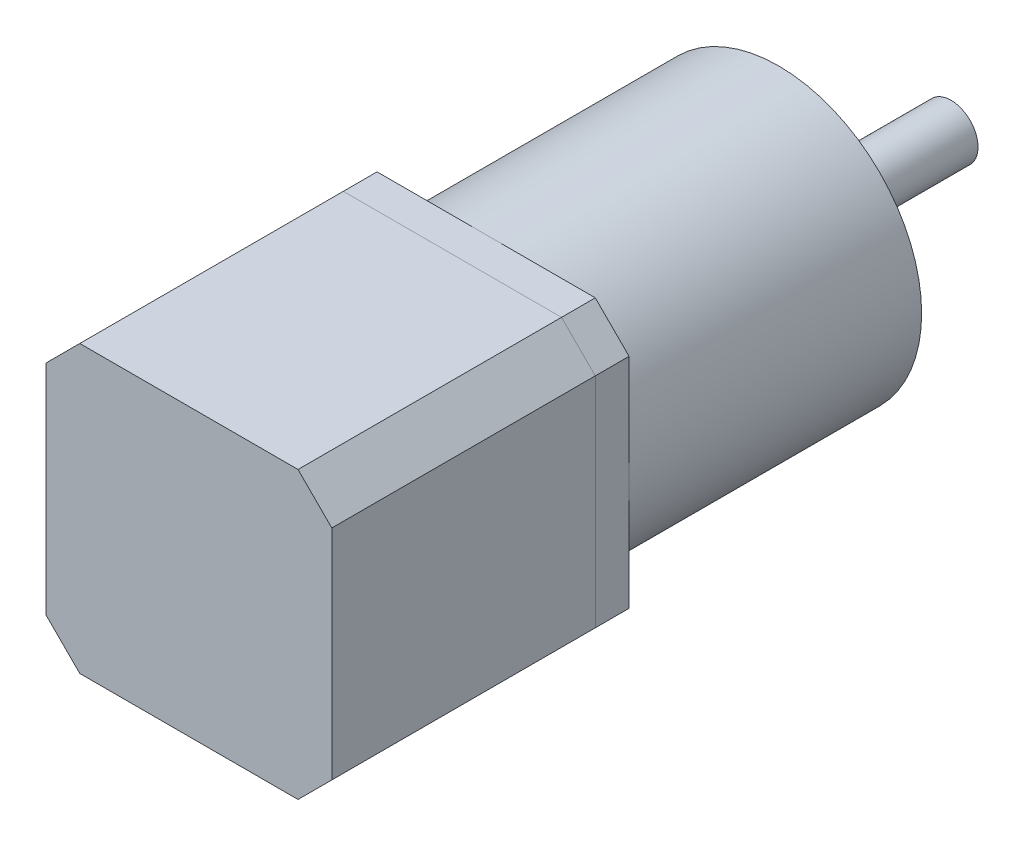
ISO-10303-21;
HEADER;
FILE_DESCRIPTION(('STEP AP214'),'2;1');
FILE_NAME('part.step','',(''),(''),'','','');
FILE_SCHEMA(('AUTOMOTIVE_DESIGN { 1 0 10303 214 1 1 1 1 }'));
ENDSEC;
DATA;
#1=APPLICATION_CONTEXT('core data for automotive mechanical design processes');
#2=APPLICATION_PROTOCOL_DEFINITION('international standard','automotive_design',2000,#1);
#3=PRODUCT_CONTEXT('',#1,'mechanical');
#4=PRODUCT('Part','Part','',(#3));
#5=PRODUCT_RELATED_PRODUCT_CATEGORY('part','',(#4));
#6=PRODUCT_DEFINITION_FORMATION('','',#4);
#7=PRODUCT_DEFINITION_CONTEXT('part definition',#1,'design');
#8=PRODUCT_DEFINITION('design','',#6,#7);
#9=PRODUCT_DEFINITION_SHAPE('','',#8);
#10=(LENGTH_UNIT() NAMED_UNIT(*) SI_UNIT(.MILLI.,.METRE.));
#11=(NAMED_UNIT(*) PLANE_ANGLE_UNIT() SI_UNIT($,.RADIAN.));
#12=(NAMED_UNIT(*) SI_UNIT($,.STERADIAN.) SOLID_ANGLE_UNIT());
#13=UNCERTAINTY_MEASURE_WITH_UNIT(LENGTH_MEASURE(1.E-05),#10,'distance_accuracy_value','');
#14=(GEOMETRIC_REPRESENTATION_CONTEXT(3) GLOBAL_UNCERTAINTY_ASSIGNED_CONTEXT((#13)) GLOBAL_UNIT_ASSIGNED_CONTEXT((#10,
#11,#12)) REPRESENTATION_CONTEXT('',''));
#15=CARTESIAN_POINT('',(0.,0.,0.));
#16=DIRECTION('',(0.,0.,1.));
#17=DIRECTION('',(1.,0.,0.));
#18=AXIS2_PLACEMENT_3D('',#15,#16,#17);
#19=CARTESIAN_POINT('',(0.,0.,-50.8));
#20=DIRECTION('',(0.,0.,1.));
#21=DIRECTION('',(1.,0.,0.));
#22=AXIS2_PLACEMENT_3D('',#19,#20,#21);
#23=CYLINDRICAL_SURFACE('',#22,6.21097509165244);
#24=CARTESIAN_POINT('',(0.,0.,-50.8));
#25=DIRECTION('',(0.,0.,-1.));
#26=DIRECTION('',(-1.,0.,0.));
#27=AXIS2_PLACEMENT_3D('',#24,#25,#26);
#28=CIRCLE('',#27,6.21097509165244);
#29=CARTESIAN_POINT('',(-6.21097509165244,0.,-50.8));
#30=VERTEX_POINT('',#29);
#31=EDGE_CURVE('E11',#30,#30,#28,.T.);
#32=ORIENTED_EDGE('',*,*,#31,.F.);
#33=EDGE_LOOP('',(#32));
#34=FACE_BOUND('',#33,.T.);
#35=CARTESIAN_POINT('',(0.,0.,-50.3));
#36=DIRECTION('',(0.,0.,-1.));
#37=DIRECTION('',(-1.,0.,0.));
#38=AXIS2_PLACEMENT_3D('',#35,#36,#37);
#39=CIRCLE('',#38,6.21097509165244);
#40=CARTESIAN_POINT('',(-6.21097509165244,0.,-50.3));
#41=VERTEX_POINT('',#40);
#42=EDGE_CURVE('E45',#41,#41,#39,.T.);
#43=ORIENTED_EDGE('',*,*,#42,.T.);
#44=EDGE_LOOP('',(#43));
#45=FACE_BOUND('',#44,.T.);
#46=ADVANCED_FACE('F42',(#34,#45),#23,.T.);
#47=CARTESIAN_POINT('',(0.,0.,-50.8));
#48=DIRECTION('',(0.,0.,-1.));
#49=DIRECTION('',(-1.,0.,0.));
#50=AXIS2_PLACEMENT_3D('',#47,#48,#49);
#51=PLANE('',#50);
#52=ORIENTED_EDGE('',*,*,#31,.T.);
#53=EDGE_LOOP('',(#52));
#54=FACE_BOUND('',#53,.T.);
#55=ADVANCED_FACE('F57',(#54),#51,.T.);
#56=CARTESIAN_POINT('',(0.,0.,-50.3));
#57=DIRECTION('',(0.,0.,-1.));
#58=DIRECTION('',(-1.,0.,0.));
#59=AXIS2_PLACEMENT_3D('',#56,#57,#58);
#60=PLANE('',#59);
#61=ORIENTED_EDGE('',*,*,#42,.F.);
#62=EDGE_LOOP('',(#61));
#63=FACE_BOUND('',#62,.T.);
#64=ADVANCED_FACE('F55',(#63),#60,.F.);
#65=CLOSED_SHELL('',(#46,#55,#64));
#66=MANIFOLD_SOLID_BREP('B2',#65);
#67=CARTESIAN_POINT('',(0.,0.,-73.8));
#68=DIRECTION('',(0.,0.,1.));
#69=DIRECTION('',(1.,0.,0.));
#70=AXIS2_PLACEMENT_3D('',#67,#68,#69);
#71=CYLINDRICAL_SURFACE('',#70,4.);
#72=CARTESIAN_POINT('',(0.,0.,-73.8));
#73=DIRECTION('',(0.,0.,-1.));
#74=DIRECTION('',(-1.,0.,0.));
#75=AXIS2_PLACEMENT_3D('',#72,#73,#74);
#76=CIRCLE('',#75,4.);
#77=CARTESIAN_POINT('',(-4.,0.,-73.8));
#78=VERTEX_POINT('',#77);
#79=EDGE_CURVE('E41',#78,#78,#76,.T.);
#80=ORIENTED_EDGE('',*,*,#79,.F.);
#81=EDGE_LOOP('',(#80));
#82=FACE_BOUND('',#81,.T.);
#83=CARTESIAN_POINT('',(0.,0.,-50.3));
#84=DIRECTION('',(0.,0.,-1.));
#85=DIRECTION('',(-1.,0.,0.));
#86=AXIS2_PLACEMENT_3D('',#83,#84,#85);
#87=CIRCLE('',#86,4.);
#88=CARTESIAN_POINT('',(-4.,0.,-50.3));
#89=VERTEX_POINT('',#88);
#90=EDGE_CURVE('E94',#89,#89,#87,.T.);
#91=ORIENTED_EDGE('',*,*,#90,.T.);
#92=EDGE_LOOP('',(#91));
#93=FACE_BOUND('',#92,.T.);
#94=ADVANCED_FACE('F91',(#82,#93),#71,.T.);
#95=CARTESIAN_POINT('',(0.,0.,-73.8));
#96=DIRECTION('',(0.,0.,-1.));
#97=DIRECTION('',(-1.,0.,0.));
#98=AXIS2_PLACEMENT_3D('',#95,#96,#97);
#99=PLANE('',#98);
#100=ORIENTED_EDGE('',*,*,#79,.T.);
#101=EDGE_LOOP('',(#100));
#102=FACE_BOUND('',#101,.T.);
#103=ADVANCED_FACE('F106',(#102),#99,.T.);
#104=CARTESIAN_POINT('',(0.,0.,-50.3));
#105=DIRECTION('',(0.,0.,-1.));
#106=DIRECTION('',(-1.,0.,0.));
#107=AXIS2_PLACEMENT_3D('',#104,#105,#106);
#108=PLANE('',#107);
#109=ORIENTED_EDGE('',*,*,#90,.F.);
#110=EDGE_LOOP('',(#109));
#111=FACE_BOUND('',#110,.T.);
#112=ADVANCED_FACE('F104',(#111),#108,.F.);
#113=CLOSED_SHELL('',(#94,#103,#112));
#114=MANIFOLD_SOLID_BREP('B6',#113);
#115=CARTESIAN_POINT('',(0.,0.,-50.3));
#116=DIRECTION('',(0.,0.,1.));
#117=DIRECTION('',(1.,0.,0.));
#118=AXIS2_PLACEMENT_3D('',#115,#116,#117);
#119=CYLINDRICAL_SURFACE('',#118,11.);
#120=CARTESIAN_POINT('',(0.,0.,-50.3));
#121=DIRECTION('',(0.,0.,-1.));
#122=DIRECTION('',(-1.,0.,0.));
#123=AXIS2_PLACEMENT_3D('',#120,#121,#122);
#124=CIRCLE('',#123,11.);
#125=CARTESIAN_POINT('',(-11.,0.,-50.3));
#126=VERTEX_POINT('',#125);
#127=EDGE_CURVE('E90',#126,#126,#124,.T.);
#128=ORIENTED_EDGE('',*,*,#127,.F.);
#129=EDGE_LOOP('',(#128));
#130=FACE_BOUND('',#129,.T.);
#131=CARTESIAN_POINT('',(0.,0.,-48.3));
#132=DIRECTION('',(0.,0.,-1.));
#133=DIRECTION('',(-1.,0.,0.));
#134=AXIS2_PLACEMENT_3D('',#131,#132,#133);
#135=CIRCLE('',#134,11.);
#136=CARTESIAN_POINT('',(-11.,0.,-48.3));
#137=VERTEX_POINT('',#136);
#138=EDGE_CURVE('E143',#137,#137,#135,.T.);
#139=ORIENTED_EDGE('',*,*,#138,.T.);
#140=EDGE_LOOP('',(#139));
#141=FACE_BOUND('',#140,.T.);
#142=ADVANCED_FACE('F140',(#130,#141),#119,.T.);
#143=CARTESIAN_POINT('',(0.,0.,-50.3));
#144=DIRECTION('',(0.,0.,-1.));
#145=DIRECTION('',(-1.,0.,0.));
#146=AXIS2_PLACEMENT_3D('',#143,#144,#145);
#147=PLANE('',#146);
#148=ORIENTED_EDGE('',*,*,#127,.T.);
#149=EDGE_LOOP('',(#148));
#150=FACE_BOUND('',#149,.T.);
#151=ADVANCED_FACE('F155',(#150),#147,.T.);
#152=CARTESIAN_POINT('',(0.,0.,-48.3));
#153=DIRECTION('',(0.,0.,-1.));
#154=DIRECTION('',(-1.,0.,0.));
#155=AXIS2_PLACEMENT_3D('',#152,#153,#154);
#156=PLANE('',#155);
#157=ORIENTED_EDGE('',*,*,#138,.F.);
#158=EDGE_LOOP('',(#157));
#159=FACE_BOUND('',#158,.T.);
#160=ADVANCED_FACE('F153',(#159),#156,.F.);
#161=CLOSED_SHELL('',(#142,#151,#160));
#162=MANIFOLD_SOLID_BREP('B36',#161);
#163=CARTESIAN_POINT('',(0.,0.,-48.3));
#164=DIRECTION('',(0.,0.,1.));
#165=DIRECTION('',(1.,0.,0.));
#166=AXIS2_PLACEMENT_3D('',#163,#164,#165);
#167=CYLINDRICAL_SURFACE('',#166,21.15);
#168=CARTESIAN_POINT('',(0.,0.,-48.3));
#169=DIRECTION('',(0.,0.,-1.));
#170=DIRECTION('',(-1.,0.,0.));
#171=AXIS2_PLACEMENT_3D('',#168,#169,#170);
#172=CIRCLE('',#171,21.15);
#173=CARTESIAN_POINT('',(21.15,0.,-48.3));
#174=VERTEX_POINT('',#173);
#175=EDGE_CURVE('E139',#174,#174,#172,.T.);
#176=CARTESIAN_POINT('',(0.,0.,-5.));
#177=DIRECTION('',(0.,0.,-1.));
#178=DIRECTION('',(-1.,0.,0.));
#179=AXIS2_PLACEMENT_3D('',#176,#177,#178);
#180=CIRCLE('',#179,21.15);
#181=CARTESIAN_POINT('',(21.15,0.,-5.));
#182=VERTEX_POINT('',#181);
#183=EDGE_CURVE('E194',#182,#182,#180,.T.);
#184=CARTESIAN_POINT('',(21.15,0.,-48.3));
#185=CARTESIAN_POINT('',(21.15,0.,-47.8489583333333));
#186=CARTESIAN_POINT('',(21.15,0.,-47.3979166666667));
#187=CARTESIAN_POINT('',(21.15,0.,-46.4958333333333));
#188=CARTESIAN_POINT('',(21.15,0.,-46.0447916666667));
#189=CARTESIAN_POINT('',(21.15,0.,-45.1427083333333));
#190=CARTESIAN_POINT('',(21.15,0.,-44.6916666666667));
#191=CARTESIAN_POINT('',(21.15,0.,-43.7895833333333));
#192=CARTESIAN_POINT('',(21.15,0.,-43.3385416666667));
#193=CARTESIAN_POINT('',(21.15,0.,-42.4364583333333));
#194=CARTESIAN_POINT('',(21.15,0.,-41.9854166666667));
#195=CARTESIAN_POINT('',(21.15,0.,-41.0833333333333));
#196=CARTESIAN_POINT('',(21.15,0.,-40.6322916666667));
#197=CARTESIAN_POINT('',(21.15,0.,-39.7302083333333));
#198=CARTESIAN_POINT('',(21.15,0.,-39.2791666666667));
#199=CARTESIAN_POINT('',(21.15,0.,-38.3770833333333));
#200=CARTESIAN_POINT('',(21.15,0.,-37.9260416666667));
#201=CARTESIAN_POINT('',(21.15,0.,-37.0239583333333));
#202=CARTESIAN_POINT('',(21.15,0.,-36.5729166666667));
#203=CARTESIAN_POINT('',(21.15,0.,-35.6708333333333));
#204=CARTESIAN_POINT('',(21.15,0.,-35.2197916666667));
#205=CARTESIAN_POINT('',(21.15,0.,-34.3177083333333));
#206=CARTESIAN_POINT('',(21.15,0.,-33.8666666666667));
#207=CARTESIAN_POINT('',(21.15,0.,-32.9645833333333));
#208=CARTESIAN_POINT('',(21.15,0.,-32.5135416666667));
#209=CARTESIAN_POINT('',(21.15,0.,-31.6114583333333));
#210=CARTESIAN_POINT('',(21.15,0.,-31.1604166666667));
#211=CARTESIAN_POINT('',(21.15,0.,-30.2583333333333));
#212=CARTESIAN_POINT('',(21.15,0.,-29.8072916666667));
#213=CARTESIAN_POINT('',(21.15,0.,-28.9052083333333));
#214=CARTESIAN_POINT('',(21.15,0.,-28.4541666666667));
#215=CARTESIAN_POINT('',(21.15,0.,-27.5520833333333));
#216=CARTESIAN_POINT('',(21.15,0.,-27.1010416666667));
#217=CARTESIAN_POINT('',(21.15,0.,-26.1989583333333));
#218=CARTESIAN_POINT('',(21.15,0.,-25.7479166666667));
#219=CARTESIAN_POINT('',(21.15,0.,-24.8458333333333));
#220=CARTESIAN_POINT('',(21.15,0.,-24.3947916666667));
#221=CARTESIAN_POINT('',(21.15,0.,-23.4927083333333));
#222=CARTESIAN_POINT('',(21.15,0.,-23.0416666666667));
#223=CARTESIAN_POINT('',(21.15,0.,-22.1395833333333));
#224=CARTESIAN_POINT('',(21.15,0.,-21.6885416666667));
#225=CARTESIAN_POINT('',(21.15,0.,-20.7864583333333));
#226=CARTESIAN_POINT('',(21.15,0.,-20.3354166666667));
#227=CARTESIAN_POINT('',(21.15,0.,-19.4333333333333));
#228=CARTESIAN_POINT('',(21.15,0.,-18.9822916666667));
#229=CARTESIAN_POINT('',(21.15,0.,-18.0802083333333));
#230=CARTESIAN_POINT('',(21.15,0.,-17.6291666666667));
#231=CARTESIAN_POINT('',(21.15,0.,-16.7270833333333));
#232=CARTESIAN_POINT('',(21.15,0.,-16.2760416666667));
#233=CARTESIAN_POINT('',(21.15,0.,-15.3739583333333));
#234=CARTESIAN_POINT('',(21.15,0.,-14.9229166666667));
#235=CARTESIAN_POINT('',(21.15,0.,-14.0208333333333));
#236=CARTESIAN_POINT('',(21.15,0.,-13.5697916666667));
#237=CARTESIAN_POINT('',(21.15,0.,-12.6677083333333));
#238=CARTESIAN_POINT('',(21.15,0.,-12.2166666666667));
#239=CARTESIAN_POINT('',(21.15,0.,-11.3145833333333));
#240=CARTESIAN_POINT('',(21.15,0.,-10.8635416666667));
#241=CARTESIAN_POINT('',(21.15,0.,-9.96145833333333));
#242=CARTESIAN_POINT('',(21.15,0.,-9.51041666666667));
#243=CARTESIAN_POINT('',(21.15,0.,-8.60833333333333));
#244=CARTESIAN_POINT('',(21.15,0.,-8.15729166666667));
#245=CARTESIAN_POINT('',(21.15,0.,-7.25520833333333));
#246=CARTESIAN_POINT('',(21.15,0.,-6.80416666666666));
#247=CARTESIAN_POINT('',(21.15,0.,-5.90208333333333));
#248=CARTESIAN_POINT('',(21.15,0.,-5.45104166666666));
#249=CARTESIAN_POINT('',(21.15,0.,-5.));
#250=B_SPLINE_CURVE_WITH_KNOTS('',3,(#184,#185,#186,#187,#188,#189,#190,#191,#192,#193,#194,
#195,#196,#197,#198,#199,#200,#201,#202,#203,#204,#205,#206,#207,#208,#209,#210,#211,#212,#213,
#214,#215,#216,#217,#218,#219,#220,#221,#222,#223,#224,#225,#226,#227,#228,#229,#230,#231,#232,
#233,#234,#235,#236,#237,#238,#239,#240,#241,#242,#243,#244,#245,#246,#247,#248,#249),
.UNSPECIFIED.,.F.,.F.,(4,2,2,2,2,2,2,2,2,2,2,2,2,2,2,2,2,2,2,2,2,2,2,2,2,2,2,2,2,2,2,2,4),(0.,
1.353125,2.70625,4.059375,5.4125,6.765625,8.11875,9.471875,10.825,12.178125,13.53125,14.884375,
16.2375,17.590625,18.94375,20.296875,21.65,23.003125,24.35625,25.709375,27.0625,28.415625,
29.76875,31.121875,32.475,33.828125,35.18125,36.534375,37.8875,39.240625,40.59375,41.946875,
43.3),.UNSPECIFIED.);
#251=EDGE_CURVE('BSEAM191',#174,#182,#250,.T.);
#252=ORIENTED_EDGE('',*,*,#175,.F.);
#253=ORIENTED_EDGE('',*,*,#183,.T.);
#254=ORIENTED_EDGE('',*,*,#251,.T.);
#255=ORIENTED_EDGE('',*,*,#251,.F.);
#256=EDGE_LOOP('',(#252,#254,#253,#255));
#257=FACE_BOUND('',#256,.T.);
#258=ADVANCED_FACE('F191',(#257),#167,.T.);
#259=CARTESIAN_POINT('',(0.,0.,-48.3));
#260=DIRECTION('',(0.,0.,-1.));
#261=DIRECTION('',(-1.,0.,0.));
#262=AXIS2_PLACEMENT_3D('',#259,#260,#261);
#263=PLANE('',#262);
#264=CARTESIAN_POINT('',(-17.5000000000005,4.95236783133562E-13,-48.3));
#265=DIRECTION('',(0.,0.,-1.));
#266=DIRECTION('',(-1.,0.,0.));
#267=AXIS2_PLACEMENT_3D('',#264,#265,#266);
#268=CIRCLE('',#267,1.14415066271215);
#269=CARTESIAN_POINT('',(-18.6441506627126,4.95236783133562E-13,-48.3));
#270=VERTEX_POINT('',#269);
#271=EDGE_CURVE('E221',#270,#270,#268,.T.);
#272=ORIENTED_EDGE('',*,*,#271,.F.);
#273=EDGE_LOOP('',(#272));
#274=FACE_BOUND('',#273,.T.);
#275=CARTESIAN_POINT('',(-9.90473566267125E-13,-17.5,-48.3));
#276=DIRECTION('',(0.,0.,-1.));
#277=DIRECTION('',(-1.,0.,0.));
#278=AXIS2_PLACEMENT_3D('',#275,#276,#277);
#279=CIRCLE('',#278,1.14415066271282);
#280=CARTESIAN_POINT('',(-1.14415066271381,-17.5,-48.3));
#281=VERTEX_POINT('',#280);
#282=EDGE_CURVE('E215',#281,#281,#279,.T.);
#283=ORIENTED_EDGE('',*,*,#282,.F.);
#284=EDGE_LOOP('',(#283));
#285=FACE_BOUND('',#284,.T.);
#286=CARTESIAN_POINT('',(17.4999999999995,-4.9737991503207E-13,-48.3));
#287=DIRECTION('',(0.,0.,-1.));
#288=DIRECTION('',(-1.,0.,0.));
#289=AXIS2_PLACEMENT_3D('',#286,#287,#288);
#290=CIRCLE('',#289,1.14415066271255);
#291=CARTESIAN_POINT('',(16.355849337287,-4.9737991503207E-13,-48.3));
#292=VERTEX_POINT('',#291);
#293=EDGE_CURVE('E209',#292,#292,#290,.T.);
#294=ORIENTED_EDGE('',*,*,#293,.F.);
#295=EDGE_LOOP('',(#294));
#296=FACE_BOUND('',#295,.T.);
#297=CARTESIAN_POINT('',(0.,17.5,-48.3));
#298=DIRECTION('',(0.,0.,-1.));
#299=DIRECTION('',(-1.,0.,0.));
#300=AXIS2_PLACEMENT_3D('',#297,#298,#299);
#301=CIRCLE('',#300,1.14415066271176);
#302=CARTESIAN_POINT('',(-1.14415066271176,17.5,-48.3));
#303=VERTEX_POINT('',#302);
#304=EDGE_CURVE('E203',#303,#303,#301,.T.);
#305=ORIENTED_EDGE('',*,*,#304,.F.);
#306=EDGE_LOOP('',(#305));
#307=FACE_BOUND('',#306,.T.);
#308=ORIENTED_EDGE('',*,*,#175,.T.);
#309=EDGE_LOOP('',(#308));
#310=FACE_BOUND('',#309,.T.);
#311=ADVANCED_FACE('F236',(#274,#285,#296,#307,#310),#263,.T.);
#312=CARTESIAN_POINT('',(0.,0.,-5.));
#313=DIRECTION('',(0.,0.,-1.));
#314=DIRECTION('',(-1.,0.,0.));
#315=AXIS2_PLACEMENT_3D('',#312,#313,#314);
#316=PLANE('',#315);
#317=ORIENTED_EDGE('',*,*,#183,.F.);
#318=EDGE_LOOP('',(#317));
#319=FACE_BOUND('',#318,.T.);
#320=ADVANCED_FACE('F239',(#319),#316,.F.);
#321=CARTESIAN_POINT('',(0.,17.5,-38.3));
#322=DIRECTION('',(0.,0.,-1.));
#323=DIRECTION('',(-1.,0.,0.));
#324=AXIS2_PLACEMENT_3D('',#321,#322,#323);
#325=CYLINDRICAL_SURFACE('',#324,1.14415066271176);
#326=CARTESIAN_POINT('',(0.,17.5,-38.3));
#327=DIRECTION('',(0.,0.,-1.));
#328=DIRECTION('',(-1.,0.,0.));
#329=AXIS2_PLACEMENT_3D('',#326,#327,#328);
#330=CIRCLE('',#329,1.14415066271176);
#331=CARTESIAN_POINT('',(-1.14415066271176,17.5,-38.3));
#332=VERTEX_POINT('',#331);
#333=EDGE_CURVE('E201',#332,#332,#330,.T.);
#334=ORIENTED_EDGE('',*,*,#333,.F.);
#335=EDGE_LOOP('',(#334));
#336=FACE_BOUND('',#335,.T.);
#337=ORIENTED_EDGE('',*,*,#304,.T.);
#338=EDGE_LOOP('',(#337));
#339=FACE_BOUND('',#338,.T.);
#340=ADVANCED_FACE('F247',(#336,#339),#325,.F.);
#341=CARTESIAN_POINT('',(0.,17.5,-38.3));
#342=DIRECTION('',(0.,0.,-1.));
#343=DIRECTION('',(-1.,0.,0.));
#344=AXIS2_PLACEMENT_3D('',#341,#342,#343);
#345=PLANE('',#344);
#346=ORIENTED_EDGE('',*,*,#333,.T.);
#347=EDGE_LOOP('',(#346));
#348=FACE_BOUND('',#347,.T.);
#349=ADVANCED_FACE('F249',(#348),#345,.T.);
#350=CARTESIAN_POINT('',(17.4999999999995,-4.9737991503207E-13,-38.3));
#351=DIRECTION('',(0.,0.,-1.));
#352=DIRECTION('',(-1.,0.,0.));
#353=AXIS2_PLACEMENT_3D('',#350,#351,#352);
#354=CYLINDRICAL_SURFACE('',#353,1.14415066271255);
#355=CARTESIAN_POINT('',(17.4999999999995,-4.9737991503207E-13,-38.3));
#356=DIRECTION('',(0.,0.,-1.));
#357=DIRECTION('',(-1.,0.,0.));
#358=AXIS2_PLACEMENT_3D('',#355,#356,#357);
#359=CIRCLE('',#358,1.14415066271255);
#360=CARTESIAN_POINT('',(16.355849337287,-4.9737991503207E-13,-38.3));
#361=VERTEX_POINT('',#360);
#362=EDGE_CURVE('E212',#361,#361,#359,.T.);
#363=ORIENTED_EDGE('',*,*,#362,.F.);
#364=EDGE_LOOP('',(#363));
#365=FACE_BOUND('',#364,.T.);
#366=ORIENTED_EDGE('',*,*,#293,.T.);
#367=EDGE_LOOP('',(#366));
#368=FACE_BOUND('',#367,.T.);
#369=ADVANCED_FACE('F256',(#365,#368),#354,.F.);
#370=CARTESIAN_POINT('',(17.4999999999995,-4.9737991503207E-13,-38.3));
#371=DIRECTION('',(0.,0.,-1.));
#372=DIRECTION('',(-1.,0.,0.));
#373=AXIS2_PLACEMENT_3D('',#370,#371,#372);
#374=PLANE('',#373);
#375=ORIENTED_EDGE('',*,*,#362,.T.);
#376=EDGE_LOOP('',(#375));
#377=FACE_BOUND('',#376,.T.);
#378=ADVANCED_FACE('F296',(#377),#374,.T.);
#379=CARTESIAN_POINT('',(-9.90473566267125E-13,-17.5,-38.3));
#380=DIRECTION('',(0.,0.,-1.));
#381=DIRECTION('',(-1.,0.,0.));
#382=AXIS2_PLACEMENT_3D('',#379,#380,#381);
#383=CYLINDRICAL_SURFACE('',#382,1.14415066271282);
#384=CARTESIAN_POINT('',(-9.90473566267125E-13,-17.5,-38.3));
#385=DIRECTION('',(0.,0.,-1.));
#386=DIRECTION('',(-1.,0.,0.));
#387=AXIS2_PLACEMENT_3D('',#384,#385,#386);
#388=CIRCLE('',#387,1.14415066271282);
#389=CARTESIAN_POINT('',(-1.14415066271381,-17.5,-38.3));
#390=VERTEX_POINT('',#389);
#391=EDGE_CURVE('E218',#390,#390,#388,.T.);
#392=ORIENTED_EDGE('',*,*,#391,.F.);
#393=EDGE_LOOP('',(#392));
#394=FACE_BOUND('',#393,.T.);
#395=ORIENTED_EDGE('',*,*,#282,.T.);
#396=EDGE_LOOP('',(#395));
#397=FACE_BOUND('',#396,.T.);
#398=ADVANCED_FACE('F305',(#394,#397),#383,.F.);
#399=CARTESIAN_POINT('',(-9.90473566267125E-13,-17.5,-38.3));
#400=DIRECTION('',(0.,0.,-1.));
#401=DIRECTION('',(-1.,0.,0.));
#402=AXIS2_PLACEMENT_3D('',#399,#400,#401);
#403=PLANE('',#402);
#404=ORIENTED_EDGE('',*,*,#391,.T.);
#405=EDGE_LOOP('',(#404));
#406=FACE_BOUND('',#405,.T.);
#407=ADVANCED_FACE('F232',(#406),#403,.T.);
#408=CARTESIAN_POINT('',(-17.5000000000005,4.95236783133562E-13,-38.3));
#409=DIRECTION('',(0.,0.,-1.));
#410=DIRECTION('',(-1.,0.,0.));
#411=AXIS2_PLACEMENT_3D('',#408,#409,#410);
#412=CYLINDRICAL_SURFACE('',#411,1.14415066271215);
#413=CARTESIAN_POINT('',(-17.5000000000005,4.95236783133562E-13,-38.3));
#414=DIRECTION('',(0.,0.,-1.));
#415=DIRECTION('',(-1.,0.,0.));
#416=AXIS2_PLACEMENT_3D('',#413,#414,#415);
#417=CIRCLE('',#416,1.14415066271215);
#418=CARTESIAN_POINT('',(-18.6441506627126,4.95236783133562E-13,-38.3));
#419=VERTEX_POINT('',#418);
#420=EDGE_CURVE('E206',#419,#419,#417,.T.);
#421=ORIENTED_EDGE('',*,*,#420,.F.);
#422=EDGE_LOOP('',(#421));
#423=FACE_BOUND('',#422,.T.);
#424=ORIENTED_EDGE('',*,*,#271,.T.);
#425=EDGE_LOOP('',(#424));
#426=FACE_BOUND('',#425,.T.);
#427=ADVANCED_FACE('F229',(#423,#426),#412,.F.);
#428=CARTESIAN_POINT('',(-17.5000000000005,4.95236783133562E-13,-38.3));
#429=DIRECTION('',(0.,0.,-1.));
#430=DIRECTION('',(-1.,0.,0.));
#431=AXIS2_PLACEMENT_3D('',#428,#429,#430);
#432=PLANE('',#431);
#433=ORIENTED_EDGE('',*,*,#420,.T.);
#434=EDGE_LOOP('',(#433));
#435=FACE_BOUND('',#434,.T.);
#436=ADVANCED_FACE('F227',(#435),#432,.T.);
#437=CLOSED_SHELL('',(#258,#311,#320,#340,#349,#369,#378,#398,#407,#427,#436));
#438=MANIFOLD_SOLID_BREP('B85',#437);
#439=CARTESIAN_POINT('',(-21.15,-21.15,-5.));
#440=DIRECTION('',(1.,0.,0.));
#441=DIRECTION('',(0.,0.,-1.));
#442=AXIS2_PLACEMENT_3D('',#439,#440,#441);
#443=PLANE('',#442);
#444=DIRECTION('',(0.,1.,0.));
#445=VECTOR('',#444,1.);
#446=CARTESIAN_POINT('',(-21.15,-21.15,-5.));
#447=LINE('',#446,#445);
#448=CARTESIAN_POINT('',(-21.15,-16.15,-5.));
#449=VERTEX_POINT('',#448);
#450=CARTESIAN_POINT('',(-21.15,16.15,-5.));
#451=VERTEX_POINT('',#450);
#452=EDGE_CURVE('E452',#449,#451,#447,.T.);
#453=ORIENTED_EDGE('',*,*,#452,.F.);
#454=DIRECTION('',(0.,0.,1.));
#455=VECTOR('',#454,1.);
#456=CARTESIAN_POINT('',(-21.15,-16.15,-5.));
#457=LINE('',#456,#455);
#458=CARTESIAN_POINT('',(-21.15,-16.15,0.));
#459=VERTEX_POINT('',#458);
#460=EDGE_CURVE('E478',#449,#459,#457,.T.);
#461=ORIENTED_EDGE('',*,*,#460,.T.);
#462=DIRECTION('',(0.,1.,0.));
#463=VECTOR('',#462,1.);
#464=CARTESIAN_POINT('',(-21.15,-21.15,0.));
#465=LINE('',#464,#463);
#466=CARTESIAN_POINT('',(-21.15,16.15,0.));
#467=VERTEX_POINT('',#466);
#468=EDGE_CURVE('E486',#459,#467,#465,.T.);
#469=ORIENTED_EDGE('',*,*,#468,.T.);
#470=DIRECTION('',(0.,0.,-1.));
#471=VECTOR('',#470,1.);
#472=CARTESIAN_POINT('',(-21.15,16.15,-5.));
#473=LINE('',#472,#471);
#474=EDGE_CURVE('E476',#467,#451,#473,.T.);
#475=ORIENTED_EDGE('',*,*,#474,.T.);
#476=EDGE_LOOP('',(#453,#461,#469,#475));
#477=FACE_BOUND('',#476,.T.);
#478=ADVANCED_FACE('F361',(#477),#443,.F.);
#479=CARTESIAN_POINT('',(21.15,21.15,-5.));
#480=DIRECTION('',(0.,-1.,0.));
#481=DIRECTION('',(0.,0.,-1.));
#482=AXIS2_PLACEMENT_3D('',#479,#480,#481);
#483=PLANE('',#482);
#484=DIRECTION('',(1.,0.,0.));
#485=VECTOR('',#484,1.);
#486=CARTESIAN_POINT('',(21.15,21.15,0.));
#487=LINE('',#486,#485);
#488=CARTESIAN_POINT('',(-16.15,21.15,0.));
#489=VERTEX_POINT('',#488);
#490=CARTESIAN_POINT('',(16.15,21.15,0.));
#491=VERTEX_POINT('',#490);
#492=EDGE_CURVE('E457',#489,#491,#487,.T.);
#493=ORIENTED_EDGE('',*,*,#492,.T.);
#494=DIRECTION('',(0.,0.,-1.));
#495=VECTOR('',#494,1.);
#496=CARTESIAN_POINT('',(16.15,21.15,-5.));
#497=LINE('',#496,#495);
#498=CARTESIAN_POINT('',(16.15,21.15,-5.));
#499=VERTEX_POINT('',#498);
#500=EDGE_CURVE('E189',#491,#499,#497,.T.);
#501=ORIENTED_EDGE('',*,*,#500,.T.);
#502=DIRECTION('',(1.,0.,0.));
#503=VECTOR('',#502,1.);
#504=CARTESIAN_POINT('',(21.15,21.15,-5.));
#505=LINE('',#504,#503);
#506=CARTESIAN_POINT('',(-16.15,21.15,-5.));
#507=VERTEX_POINT('',#506);
#508=EDGE_CURVE('E455',#507,#499,#505,.T.);
#509=ORIENTED_EDGE('',*,*,#508,.F.);
#510=DIRECTION('',(0.,0.,1.));
#511=VECTOR('',#510,1.);
#512=CARTESIAN_POINT('',(-16.15,21.15,-5.));
#513=LINE('',#512,#511);
#514=EDGE_CURVE('E369',#507,#489,#513,.T.);
#515=ORIENTED_EDGE('',*,*,#514,.T.);
#516=EDGE_LOOP('',(#493,#501,#509,#515));
#517=FACE_BOUND('',#516,.T.);
#518=ADVANCED_FACE('F483',(#517),#483,.F.);
#519=CARTESIAN_POINT('',(21.15,-21.15,-5.));
#520=DIRECTION('',(-1.,0.,0.));
#521=DIRECTION('',(0.,0.,1.));
#522=AXIS2_PLACEMENT_3D('',#519,#520,#521);
#523=PLANE('',#522);
#524=DIRECTION('',(0.,-1.,0.));
#525=VECTOR('',#524,1.);
#526=CARTESIAN_POINT('',(21.15,-21.15,0.));
#527=LINE('',#526,#525);
#528=CARTESIAN_POINT('',(21.15,16.15,0.));
#529=VERTEX_POINT('',#528);
#530=CARTESIAN_POINT('',(21.15,-16.15,0.));
#531=VERTEX_POINT('',#530);
#532=EDGE_CURVE('E453',#529,#531,#527,.T.);
#533=ORIENTED_EDGE('',*,*,#532,.T.);
#534=DIRECTION('',(0.,0.,-1.));
#535=VECTOR('',#534,1.);
#536=CARTESIAN_POINT('',(21.15,-16.15,-5.));
#537=LINE('',#536,#535);
#538=CARTESIAN_POINT('',(21.15,-16.15,-5.));
#539=VERTEX_POINT('',#538);
#540=EDGE_CURVE('E431',#531,#539,#537,.T.);
#541=ORIENTED_EDGE('',*,*,#540,.T.);
#542=DIRECTION('',(0.,-1.,0.));
#543=VECTOR('',#542,1.);
#544=CARTESIAN_POINT('',(21.15,-21.15,-5.));
#545=LINE('',#544,#543);
#546=CARTESIAN_POINT('',(21.15,16.15,-5.));
#547=VERTEX_POINT('',#546);
#548=EDGE_CURVE('E490',#547,#539,#545,.T.);
#549=ORIENTED_EDGE('',*,*,#548,.F.);
#550=DIRECTION('',(0.,0.,1.));
#551=VECTOR('',#550,1.);
#552=CARTESIAN_POINT('',(21.15,16.15,-5.));
#553=LINE('',#552,#551);
#554=EDGE_CURVE('E436',#547,#529,#553,.T.);
#555=ORIENTED_EDGE('',*,*,#554,.T.);
#556=EDGE_LOOP('',(#533,#541,#549,#555));
#557=FACE_BOUND('',#556,.T.);
#558=ADVANCED_FACE('F500',(#557),#523,.F.);
#559=CARTESIAN_POINT('',(21.15,-21.15,-5.));
#560=DIRECTION('',(0.,1.,0.));
#561=DIRECTION('',(0.,0.,1.));
#562=AXIS2_PLACEMENT_3D('',#559,#560,#561);
#563=PLANE('',#562);
#564=DIRECTION('',(-1.,0.,0.));
#565=VECTOR('',#564,1.);
#566=CARTESIAN_POINT('',(21.15,-21.15,-5.));
#567=LINE('',#566,#565);
#568=CARTESIAN_POINT('',(16.15,-21.15,-5.));
#569=VERTEX_POINT('',#568);
#570=CARTESIAN_POINT('',(-16.15,-21.15,-5.));
#571=VERTEX_POINT('',#570);
#572=EDGE_CURVE('E446',#569,#571,#567,.T.);
#573=ORIENTED_EDGE('',*,*,#572,.F.);
#574=DIRECTION('',(0.,0.,1.));
#575=VECTOR('',#574,1.);
#576=CARTESIAN_POINT('',(16.15,-21.15,-5.));
#577=LINE('',#576,#575);
#578=CARTESIAN_POINT('',(16.15,-21.15,0.));
#579=VERTEX_POINT('',#578);
#580=EDGE_CURVE('E430',#569,#579,#577,.T.);
#581=ORIENTED_EDGE('',*,*,#580,.T.);
#582=DIRECTION('',(-1.,0.,0.));
#583=VECTOR('',#582,1.);
#584=CARTESIAN_POINT('',(21.15,-21.15,0.));
#585=LINE('',#584,#583);
#586=CARTESIAN_POINT('',(-16.15,-21.15,0.));
#587=VERTEX_POINT('',#586);
#588=EDGE_CURVE('E443',#579,#587,#585,.T.);
#589=ORIENTED_EDGE('',*,*,#588,.T.);
#590=DIRECTION('',(0.,0.,-1.));
#591=VECTOR('',#590,1.);
#592=CARTESIAN_POINT('',(-16.15,-21.15,-5.));
#593=LINE('',#592,#591);
#594=EDGE_CURVE('E448',#587,#571,#593,.T.);
#595=ORIENTED_EDGE('',*,*,#594,.T.);
#596=EDGE_LOOP('',(#573,#581,#589,#595));
#597=FACE_BOUND('',#596,.T.);
#598=ADVANCED_FACE('F442',(#597),#563,.F.);
#599=CARTESIAN_POINT('',(0.,0.,-5.));
#600=DIRECTION('',(0.,0.,1.));
#601=DIRECTION('',(1.,0.,0.));
#602=AXIS2_PLACEMENT_3D('',#599,#600,#601);
#603=PLANE('',#602);
#604=ORIENTED_EDGE('',*,*,#548,.T.);
#605=DIRECTION('',(0.707106781186546,0.707106781186549,0.));
#606=VECTOR('',#605,1.);
#607=CARTESIAN_POINT('',(16.15,-21.15,-5.));
#608=LINE('',#607,#606);
#609=EDGE_CURVE('E474',#539,#569,#608,.F.);
#610=ORIENTED_EDGE('',*,*,#609,.T.);
#611=ORIENTED_EDGE('',*,*,#572,.T.);
#612=DIRECTION('',(0.707106781186549,-0.707106781186546,0.));
#613=VECTOR('',#612,1.);
#614=CARTESIAN_POINT('',(-21.15,-16.15,-5.));
#615=LINE('',#614,#613);
#616=EDGE_CURVE('E472',#571,#449,#615,.F.);
#617=ORIENTED_EDGE('',*,*,#616,.T.);
#618=ORIENTED_EDGE('',*,*,#452,.T.);
#619=DIRECTION('',(-0.707106781186546,-0.707106781186549,0.));
#620=VECTOR('',#619,1.);
#621=CARTESIAN_POINT('',(-16.15,21.15,-5.));
#622=LINE('',#621,#620);
#623=EDGE_CURVE('E381',#451,#507,#622,.F.);
#624=ORIENTED_EDGE('',*,*,#623,.T.);
#625=ORIENTED_EDGE('',*,*,#508,.T.);
#626=DIRECTION('',(-0.707106781186549,0.707106781186546,0.));
#627=VECTOR('',#626,1.);
#628=CARTESIAN_POINT('',(21.15,16.15,-5.));
#629=LINE('',#628,#627);
#630=EDGE_CURVE('E470',#499,#547,#629,.F.);
#631=ORIENTED_EDGE('',*,*,#630,.T.);
#632=EDGE_LOOP('',(#604,#610,#611,#617,#618,#624,#625,#631));
#633=FACE_BOUND('',#632,.T.);
#634=ADVANCED_FACE('F494',(#633),#603,.F.);
#635=CARTESIAN_POINT('',(0.,0.,0.));
#636=DIRECTION('',(0.,0.,1.));
#637=DIRECTION('',(1.,0.,0.));
#638=AXIS2_PLACEMENT_3D('',#635,#636,#637);
#639=PLANE('',#638);
#640=ORIENTED_EDGE('',*,*,#588,.F.);
#641=DIRECTION('',(-0.707106781186546,-0.707106781186549,0.));
#642=VECTOR('',#641,1.);
#643=CARTESIAN_POINT('',(18.65,-18.6499999999999,0.));
#644=LINE('',#643,#642);
#645=EDGE_CURVE('E426',#579,#531,#644,.F.);
#646=ORIENTED_EDGE('',*,*,#645,.T.);
#647=ORIENTED_EDGE('',*,*,#532,.F.);
#648=DIRECTION('',(0.707106781186549,-0.707106781186546,0.));
#649=VECTOR('',#648,1.);
#650=CARTESIAN_POINT('',(18.6499999999999,18.65,0.));
#651=LINE('',#650,#649);
#652=EDGE_CURVE('E463',#529,#491,#651,.F.);
#653=ORIENTED_EDGE('',*,*,#652,.T.);
#654=ORIENTED_EDGE('',*,*,#492,.F.);
#655=DIRECTION('',(0.707106781186546,0.707106781186549,0.));
#656=VECTOR('',#655,1.);
#657=CARTESIAN_POINT('',(-18.65,18.65,0.));
#658=LINE('',#657,#656);
#659=EDGE_CURVE('E447',#489,#467,#658,.F.);
#660=ORIENTED_EDGE('',*,*,#659,.T.);
#661=ORIENTED_EDGE('',*,*,#468,.F.);
#662=DIRECTION('',(-0.707106781186549,0.707106781186546,0.));
#663=VECTOR('',#662,1.);
#664=CARTESIAN_POINT('',(-18.65,-18.65,0.));
#665=LINE('',#664,#663);
#666=EDGE_CURVE('E437',#459,#587,#665,.F.);
#667=ORIENTED_EDGE('',*,*,#666,.T.);
#668=EDGE_LOOP('',(#640,#646,#647,#653,#654,#660,#661,#667));
#669=FACE_BOUND('',#668,.T.);
#670=ADVANCED_FACE('F450',(#669),#639,.T.);
#671=CARTESIAN_POINT('',(16.15,-21.15,-5.));
#672=DIRECTION('',(-0.707106781186549,0.707106781186546,0.));
#673=DIRECTION('',(0.,0.,1.));
#674=AXIS2_PLACEMENT_3D('',#671,#672,#673);
#675=PLANE('',#674);
#676=ORIENTED_EDGE('',*,*,#609,.F.);
#677=ORIENTED_EDGE('',*,*,#540,.F.);
#678=ORIENTED_EDGE('',*,*,#645,.F.);
#679=ORIENTED_EDGE('',*,*,#580,.F.);
#680=EDGE_LOOP('',(#676,#677,#678,#679));
#681=FACE_BOUND('',#680,.T.);
#682=ADVANCED_FACE('F429',(#681),#675,.F.);
#683=CARTESIAN_POINT('',(-21.15,-16.15,-5.));
#684=DIRECTION('',(0.707106781186546,0.707106781186549,0.));
#685=DIRECTION('',(0.,0.,1.));
#686=AXIS2_PLACEMENT_3D('',#683,#684,#685);
#687=PLANE('',#686);
#688=ORIENTED_EDGE('',*,*,#616,.F.);
#689=ORIENTED_EDGE('',*,*,#594,.F.);
#690=ORIENTED_EDGE('',*,*,#666,.F.);
#691=ORIENTED_EDGE('',*,*,#460,.F.);
#692=EDGE_LOOP('',(#688,#689,#690,#691));
#693=FACE_BOUND('',#692,.T.);
#694=ADVANCED_FACE('F505',(#693),#687,.F.);
#695=CARTESIAN_POINT('',(21.15,16.15,-5.));
#696=DIRECTION('',(-0.707106781186546,-0.707106781186549,0.));
#697=DIRECTION('',(0.,0.,1.));
#698=AXIS2_PLACEMENT_3D('',#695,#696,#697);
#699=PLANE('',#698);
#700=ORIENTED_EDGE('',*,*,#630,.F.);
#701=ORIENTED_EDGE('',*,*,#500,.F.);
#702=ORIENTED_EDGE('',*,*,#652,.F.);
#703=ORIENTED_EDGE('',*,*,#554,.F.);
#704=EDGE_LOOP('',(#700,#701,#702,#703));
#705=FACE_BOUND('',#704,.T.);
#706=ADVANCED_FACE('F498',(#705),#699,.F.);
#707=CARTESIAN_POINT('',(-16.15,21.15,-5.));
#708=DIRECTION('',(0.707106781186549,-0.707106781186546,0.));
#709=DIRECTION('',(0.,0.,1.));
#710=AXIS2_PLACEMENT_3D('',#707,#708,#709);
#711=PLANE('',#710);
#712=ORIENTED_EDGE('',*,*,#623,.F.);
#713=ORIENTED_EDGE('',*,*,#474,.F.);
#714=ORIENTED_EDGE('',*,*,#659,.F.);
#715=ORIENTED_EDGE('',*,*,#514,.F.);
#716=EDGE_LOOP('',(#712,#713,#714,#715));
#717=FACE_BOUND('',#716,.T.);
#718=ADVANCED_FACE('F363',(#717),#711,.F.);
#719=CLOSED_SHELL('',(#478,#518,#558,#598,#634,#670,#682,#694,#706,#718));
#720=MANIFOLD_SOLID_BREP('B134',#719);
#721=CARTESIAN_POINT('',(21.15,21.15,39.));
#722=DIRECTION('',(-1.,0.,0.));
#723=DIRECTION('',(0.,-1.,0.));
#724=AXIS2_PLACEMENT_3D('',#721,#722,#723);
#725=PLANE('',#724);
#726=DIRECTION('',(0.,1.,0.));
#727=VECTOR('',#726,1.);
#728=CARTESIAN_POINT('',(21.15,21.15,39.));
#729=LINE('',#728,#727);
#730=CARTESIAN_POINT('',(21.15,-16.15,39.));
#731=VERTEX_POINT('',#730);
#732=CARTESIAN_POINT('',(21.15,16.15,39.));
#733=VERTEX_POINT('',#732);
#734=EDGE_CURVE('E680',#731,#733,#729,.T.);
#735=ORIENTED_EDGE('',*,*,#734,.F.);
#736=DIRECTION('',(0.,0.,-1.));
#737=VECTOR('',#736,1.);
#738=CARTESIAN_POINT('',(21.15,-16.15,39.));
#739=LINE('',#738,#737);
#740=CARTESIAN_POINT('',(21.15,-16.15,0.));
#741=VERTEX_POINT('',#740);
#742=EDGE_CURVE('E706',#731,#741,#739,.T.);
#743=ORIENTED_EDGE('',*,*,#742,.T.);
#744=DIRECTION('',(0.,1.,0.));
#745=VECTOR('',#744,1.);
#746=CARTESIAN_POINT('',(21.15,21.15,0.));
#747=LINE('',#746,#745);
#748=CARTESIAN_POINT('',(21.15,16.15,0.));
#749=VERTEX_POINT('',#748);
#750=EDGE_CURVE('E714',#741,#749,#747,.T.);
#751=ORIENTED_EDGE('',*,*,#750,.T.);
#752=DIRECTION('',(0.,0.,1.));
#753=VECTOR('',#752,1.);
#754=CARTESIAN_POINT('',(21.15,16.15,39.));
#755=LINE('',#754,#753);
#756=EDGE_CURVE('E704',#749,#733,#755,.T.);
#757=ORIENTED_EDGE('',*,*,#756,.T.);
#758=EDGE_LOOP('',(#735,#743,#751,#757));
#759=FACE_BOUND('',#758,.T.);
#760=ADVANCED_FACE('F589',(#759),#725,.F.);
#761=CARTESIAN_POINT('',(-21.15,21.15,39.));
#762=DIRECTION('',(0.,-1.,0.));
#763=DIRECTION('',(0.,0.,-1.));
#764=AXIS2_PLACEMENT_3D('',#761,#762,#763);
#765=PLANE('',#764);
#766=DIRECTION('',(-1.,0.,0.));
#767=VECTOR('',#766,1.);
#768=CARTESIAN_POINT('',(-21.15,21.15,0.));
#769=LINE('',#768,#767);
#770=CARTESIAN_POINT('',(16.15,21.15,0.));
#771=VERTEX_POINT('',#770);
#772=CARTESIAN_POINT('',(-16.15,21.15,0.));
#773=VERTEX_POINT('',#772);
#774=EDGE_CURVE('E685',#771,#773,#769,.T.);
#775=ORIENTED_EDGE('',*,*,#774,.T.);
#776=DIRECTION('',(0.,0.,1.));
#777=VECTOR('',#776,1.);
#778=CARTESIAN_POINT('',(-16.15,21.15,39.));
#779=LINE('',#778,#777);
#780=CARTESIAN_POINT('',(-16.15,21.15,39.));
#781=VERTEX_POINT('',#780);
#782=EDGE_CURVE('E359',#773,#781,#779,.T.);
#783=ORIENTED_EDGE('',*,*,#782,.T.);
#784=DIRECTION('',(-1.,0.,0.));
#785=VECTOR('',#784,1.);
#786=CARTESIAN_POINT('',(-21.15,21.15,39.));
#787=LINE('',#786,#785);
#788=CARTESIAN_POINT('',(16.15,21.15,39.));
#789=VERTEX_POINT('',#788);
#790=EDGE_CURVE('E683',#789,#781,#787,.T.);
#791=ORIENTED_EDGE('',*,*,#790,.F.);
#792=DIRECTION('',(0.,0.,-1.));
#793=VECTOR('',#792,1.);
#794=CARTESIAN_POINT('',(16.15,21.15,39.));
#795=LINE('',#794,#793);
#796=EDGE_CURVE('E597',#789,#771,#795,.T.);
#797=ORIENTED_EDGE('',*,*,#796,.T.);
#798=EDGE_LOOP('',(#775,#783,#791,#797));
#799=FACE_BOUND('',#798,.T.);
#800=ADVANCED_FACE('F711',(#799),#765,.F.);
#801=CARTESIAN_POINT('',(-21.15,21.15,39.));
#802=DIRECTION('',(1.,0.,0.));
#803=DIRECTION('',(0.,1.,0.));
#804=AXIS2_PLACEMENT_3D('',#801,#802,#803);
#805=PLANE('',#804);
#806=DIRECTION('',(0.,-1.,0.));
#807=VECTOR('',#806,1.);
#808=CARTESIAN_POINT('',(-21.15,21.15,0.));
#809=LINE('',#808,#807);
#810=CARTESIAN_POINT('',(-21.15,16.15,0.));
#811=VERTEX_POINT('',#810);
#812=CARTESIAN_POINT('',(-21.15,-16.15,0.));
#813=VERTEX_POINT('',#812);
#814=EDGE_CURVE('E681',#811,#813,#809,.T.);
#815=ORIENTED_EDGE('',*,*,#814,.T.);
#816=DIRECTION('',(0.,0.,1.));
#817=VECTOR('',#816,1.);
#818=CARTESIAN_POINT('',(-21.15,-16.15,39.));
#819=LINE('',#818,#817);
#820=CARTESIAN_POINT('',(-21.15,-16.15,39.));
#821=VERTEX_POINT('',#820);
#822=EDGE_CURVE('E659',#813,#821,#819,.T.);
#823=ORIENTED_EDGE('',*,*,#822,.T.);
#824=DIRECTION('',(0.,-1.,0.));
#825=VECTOR('',#824,1.);
#826=CARTESIAN_POINT('',(-21.15,21.15,39.));
#827=LINE('',#826,#825);
#828=CARTESIAN_POINT('',(-21.15,16.15,39.));
#829=VERTEX_POINT('',#828);
#830=EDGE_CURVE('E718',#829,#821,#827,.T.);
#831=ORIENTED_EDGE('',*,*,#830,.F.);
#832=DIRECTION('',(0.,0.,-1.));
#833=VECTOR('',#832,1.);
#834=CARTESIAN_POINT('',(-21.15,16.15,39.));
#835=LINE('',#834,#833);
#836=EDGE_CURVE('E664',#829,#811,#835,.T.);
#837=ORIENTED_EDGE('',*,*,#836,.T.);
#838=EDGE_LOOP('',(#815,#823,#831,#837));
#839=FACE_BOUND('',#838,.T.);
#840=ADVANCED_FACE('F728',(#839),#805,.F.);
#841=CARTESIAN_POINT('',(-21.15,-21.15,39.));
#842=DIRECTION('',(0.,1.,0.));
#843=DIRECTION('',(0.,0.,1.));
#844=AXIS2_PLACEMENT_3D('',#841,#842,#843);
#845=PLANE('',#844);
#846=DIRECTION('',(1.,0.,0.));
#847=VECTOR('',#846,1.);
#848=CARTESIAN_POINT('',(-21.15,-21.15,39.));
#849=LINE('',#848,#847);
#850=CARTESIAN_POINT('',(-16.15,-21.15,39.));
#851=VERTEX_POINT('',#850);
#852=CARTESIAN_POINT('',(16.15,-21.15,39.));
#853=VERTEX_POINT('',#852);
#854=EDGE_CURVE('E674',#851,#853,#849,.T.);
#855=ORIENTED_EDGE('',*,*,#854,.F.);
#856=DIRECTION('',(0.,0.,-1.));
#857=VECTOR('',#856,1.);
#858=CARTESIAN_POINT('',(-16.15,-21.15,39.));
#859=LINE('',#858,#857);
#860=CARTESIAN_POINT('',(-16.15,-21.15,0.));
#861=VERTEX_POINT('',#860);
#862=EDGE_CURVE('E658',#851,#861,#859,.T.);
#863=ORIENTED_EDGE('',*,*,#862,.T.);
#864=DIRECTION('',(1.,0.,0.));
#865=VECTOR('',#864,1.);
#866=CARTESIAN_POINT('',(-21.15,-21.15,0.));
#867=LINE('',#866,#865);
#868=CARTESIAN_POINT('',(16.15,-21.15,0.));
#869=VERTEX_POINT('',#868);
#870=EDGE_CURVE('E671',#861,#869,#867,.T.);
#871=ORIENTED_EDGE('',*,*,#870,.T.);
#872=DIRECTION('',(0.,0.,1.));
#873=VECTOR('',#872,1.);
#874=CARTESIAN_POINT('',(16.15,-21.15,39.));
#875=LINE('',#874,#873);
#876=EDGE_CURVE('E676',#869,#853,#875,.T.);
#877=ORIENTED_EDGE('',*,*,#876,.T.);
#878=EDGE_LOOP('',(#855,#863,#871,#877));
#879=FACE_BOUND('',#878,.T.);
#880=ADVANCED_FACE('F670',(#879),#845,.F.);
#881=CARTESIAN_POINT('',(0.,0.,39.));
#882=DIRECTION('',(0.,0.,1.));
#883=DIRECTION('',(1.,0.,0.));
#884=AXIS2_PLACEMENT_3D('',#881,#882,#883);
#885=PLANE('',#884);
#886=ORIENTED_EDGE('',*,*,#830,.T.);
#887=DIRECTION('',(-0.707106781186546,0.707106781186549,0.));
#888=VECTOR('',#887,1.);
#889=CARTESIAN_POINT('',(-18.65,-18.65,39.));
#890=LINE('',#889,#888);
#891=EDGE_CURVE('E702',#821,#851,#890,.F.);
#892=ORIENTED_EDGE('',*,*,#891,.T.);
#893=ORIENTED_EDGE('',*,*,#854,.T.);
#894=DIRECTION('',(-0.707106781186549,-0.707106781186546,0.));
#895=VECTOR('',#894,1.);
#896=CARTESIAN_POINT('',(18.65,-18.65,39.));
#897=LINE('',#896,#895);
#898=EDGE_CURVE('E700',#853,#731,#897,.F.);
#899=ORIENTED_EDGE('',*,*,#898,.T.);
#900=ORIENTED_EDGE('',*,*,#734,.T.);
#901=DIRECTION('',(0.707106781186546,-0.707106781186549,0.));
#902=VECTOR('',#901,1.);
#903=CARTESIAN_POINT('',(18.65,18.65,39.));
#904=LINE('',#903,#902);
#905=EDGE_CURVE('E609',#733,#789,#904,.F.);
#906=ORIENTED_EDGE('',*,*,#905,.T.);
#907=ORIENTED_EDGE('',*,*,#790,.T.);
#908=DIRECTION('',(0.707106781186549,0.707106781186547,0.));
#909=VECTOR('',#908,1.);
#910=CARTESIAN_POINT('',(-18.65,18.65,39.));
#911=LINE('',#910,#909);
#912=EDGE_CURVE('E698',#781,#829,#911,.F.);
#913=ORIENTED_EDGE('',*,*,#912,.T.);
#914=EDGE_LOOP('',(#886,#892,#893,#899,#900,#906,#907,#913));
#915=FACE_BOUND('',#914,.T.);
#916=ADVANCED_FACE('F722',(#915),#885,.T.);
#917=CARTESIAN_POINT('',(0.,0.,0.));
#918=DIRECTION('',(0.,0.,1.));
#919=DIRECTION('',(1.,0.,0.));
#920=AXIS2_PLACEMENT_3D('',#917,#918,#919);
#921=PLANE('',#920);
#922=ORIENTED_EDGE('',*,*,#870,.F.);
#923=DIRECTION('',(0.707106781186546,-0.707106781186549,0.));
#924=VECTOR('',#923,1.);
#925=CARTESIAN_POINT('',(-16.15,-21.15,0.));
#926=LINE('',#925,#924);
#927=EDGE_CURVE('E654',#861,#813,#926,.F.);
#928=ORIENTED_EDGE('',*,*,#927,.T.);
#929=ORIENTED_EDGE('',*,*,#814,.F.);
#930=DIRECTION('',(-0.707106781186549,-0.707106781186547,0.));
#931=VECTOR('',#930,1.);
#932=CARTESIAN_POINT('',(-21.15,16.15,0.));
#933=LINE('',#932,#931);
#934=EDGE_CURVE('E691',#811,#773,#933,.F.);
#935=ORIENTED_EDGE('',*,*,#934,.T.);
#936=ORIENTED_EDGE('',*,*,#774,.F.);
#937=DIRECTION('',(-0.707106781186546,0.707106781186549,0.));
#938=VECTOR('',#937,1.);
#939=CARTESIAN_POINT('',(16.15,21.15,0.));
#940=LINE('',#939,#938);
#941=EDGE_CURVE('E675',#771,#749,#940,.F.);
#942=ORIENTED_EDGE('',*,*,#941,.T.);
#943=ORIENTED_EDGE('',*,*,#750,.F.);
#944=DIRECTION('',(0.707106781186549,0.707106781186546,0.));
#945=VECTOR('',#944,1.);
#946=CARTESIAN_POINT('',(21.15,-16.15,0.));
#947=LINE('',#946,#945);
#948=EDGE_CURVE('E665',#741,#869,#947,.F.);
#949=ORIENTED_EDGE('',*,*,#948,.T.);
#950=EDGE_LOOP('',(#922,#928,#929,#935,#936,#942,#943,#949));
#951=FACE_BOUND('',#950,.T.);
#952=ADVANCED_FACE('F678',(#951),#921,.F.);
#953=CARTESIAN_POINT('',(-16.15,-21.15,39.));
#954=DIRECTION('',(0.707106781186549,0.707106781186546,0.));
#955=DIRECTION('',(0.,0.,-1.));
#956=AXIS2_PLACEMENT_3D('',#953,#954,#955);
#957=PLANE('',#956);
#958=ORIENTED_EDGE('',*,*,#891,.F.);
#959=ORIENTED_EDGE('',*,*,#822,.F.);
#960=ORIENTED_EDGE('',*,*,#927,.F.);
#961=ORIENTED_EDGE('',*,*,#862,.F.);
#962=EDGE_LOOP('',(#958,#959,#960,#961));
#963=FACE_BOUND('',#962,.T.);
#964=ADVANCED_FACE('F657',(#963),#957,.F.);
#965=CARTESIAN_POINT('',(21.15,-16.15,39.));
#966=DIRECTION('',(-0.707106781186546,0.707106781186549,0.));
#967=DIRECTION('',(0.,0.,-1.));
#968=AXIS2_PLACEMENT_3D('',#965,#966,#967);
#969=PLANE('',#968);
#970=ORIENTED_EDGE('',*,*,#898,.F.);
#971=ORIENTED_EDGE('',*,*,#876,.F.);
#972=ORIENTED_EDGE('',*,*,#948,.F.);
#973=ORIENTED_EDGE('',*,*,#742,.F.);
#974=EDGE_LOOP('',(#970,#971,#972,#973));
#975=FACE_BOUND('',#974,.T.);
#976=ADVANCED_FACE('F733',(#975),#969,.F.);
#977=CARTESIAN_POINT('',(-21.15,16.15,39.));
#978=DIRECTION('',(0.707106781186547,-0.707106781186549,0.));
#979=DIRECTION('',(0.,0.,-1.));
#980=AXIS2_PLACEMENT_3D('',#977,#978,#979);
#981=PLANE('',#980);
#982=ORIENTED_EDGE('',*,*,#912,.F.);
#983=ORIENTED_EDGE('',*,*,#782,.F.);
#984=ORIENTED_EDGE('',*,*,#934,.F.);
#985=ORIENTED_EDGE('',*,*,#836,.F.);
#986=EDGE_LOOP('',(#982,#983,#984,#985));
#987=FACE_BOUND('',#986,.T.);
#988=ADVANCED_FACE('F726',(#987),#981,.F.);
#989=CARTESIAN_POINT('',(16.15,21.15,39.));
#990=DIRECTION('',(-0.707106781186549,-0.707106781186546,0.));
#991=DIRECTION('',(0.,0.,-1.));
#992=AXIS2_PLACEMENT_3D('',#989,#990,#991);
#993=PLANE('',#992);
#994=ORIENTED_EDGE('',*,*,#905,.F.);
#995=ORIENTED_EDGE('',*,*,#756,.F.);
#996=ORIENTED_EDGE('',*,*,#941,.F.);
#997=ORIENTED_EDGE('',*,*,#796,.F.);
#998=EDGE_LOOP('',(#994,#995,#996,#997));
#999=FACE_BOUND('',#998,.T.);
#1000=ADVANCED_FACE('F591',(#999),#993,.F.);
#1001=CLOSED_SHELL('',(#760,#800,#840,#880,#916,#952,#964,#976,#988,#1000));
#1002=MANIFOLD_SOLID_BREP('B183',#1001);
#1003=ADVANCED_BREP_SHAPE_REPRESENTATION('',(#18,#66,#114,#162,#438,#720,#1002),#14);
#1004=SHAPE_DEFINITION_REPRESENTATION(#9,#1003);
ENDSEC;
END-ISO-10303-21;
